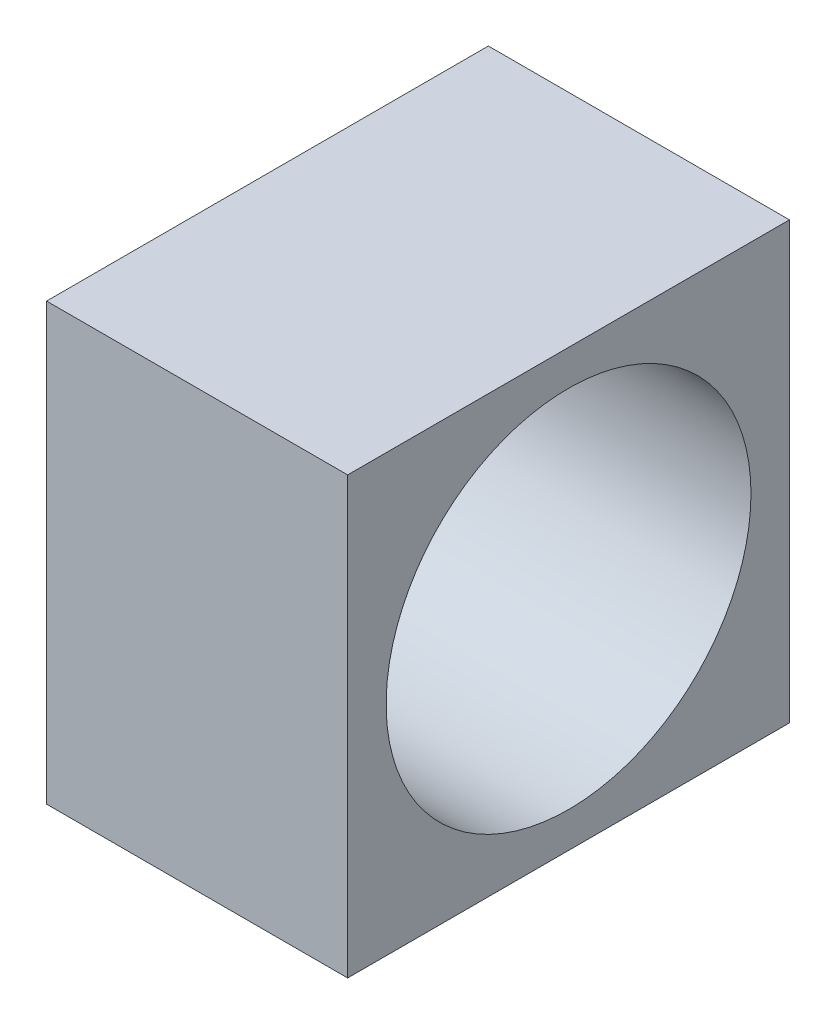
ISO-10303-21;
HEADER;
FILE_DESCRIPTION(('STEP AP214'),'2;1');
FILE_NAME('part.step','',(''),(''),'','','');
FILE_SCHEMA(('AUTOMOTIVE_DESIGN { 1 0 10303 214 1 1 1 1 }'));
ENDSEC;
DATA;
#1=APPLICATION_CONTEXT('core data for automotive mechanical design processes');
#2=APPLICATION_PROTOCOL_DEFINITION('international standard','automotive_design',2000,#1);
#3=PRODUCT_CONTEXT('',#1,'mechanical');
#4=PRODUCT('Part','Part','',(#3));
#5=PRODUCT_RELATED_PRODUCT_CATEGORY('part','',(#4));
#6=PRODUCT_DEFINITION_FORMATION('','',#4);
#7=PRODUCT_DEFINITION_CONTEXT('part definition',#1,'design');
#8=PRODUCT_DEFINITION('design','',#6,#7);
#9=PRODUCT_DEFINITION_SHAPE('','',#8);
#10=(LENGTH_UNIT() NAMED_UNIT(*) SI_UNIT(.MILLI.,.METRE.));
#11=(NAMED_UNIT(*) PLANE_ANGLE_UNIT() SI_UNIT($,.RADIAN.));
#12=(NAMED_UNIT(*) SI_UNIT($,.STERADIAN.) SOLID_ANGLE_UNIT());
#13=UNCERTAINTY_MEASURE_WITH_UNIT(LENGTH_MEASURE(1.E-05),#10,'distance_accuracy_value','');
#14=(GEOMETRIC_REPRESENTATION_CONTEXT(3) GLOBAL_UNCERTAINTY_ASSIGNED_CONTEXT((#13)) GLOBAL_UNIT_ASSIGNED_CONTEXT((#10,
#11,#12)) REPRESENTATION_CONTEXT('',''));
#15=CARTESIAN_POINT('',(0.,0.,0.));
#16=DIRECTION('',(0.,0.,1.));
#17=DIRECTION('',(1.,0.,0.));
#18=AXIS2_PLACEMENT_3D('',#15,#16,#17);
#19=CARTESIAN_POINT('',(8.5,0.,0.));
#20=DIRECTION('',(1.,0.,0.));
#21=DIRECTION('',(0.,0.,-1.));
#22=AXIS2_PLACEMENT_3D('',#19,#20,#21);
#23=PLANE('',#22);
#24=DIRECTION('',(0.,1.,0.));
#25=VECTOR('',#24,1.);
#26=CARTESIAN_POINT('',(8.5,6.15,-6.23588768431528));
#27=LINE('',#26,#25);
#28=CARTESIAN_POINT('',(8.5,-6.15,-6.23588768431528));
#29=VERTEX_POINT('',#28);
#30=CARTESIAN_POINT('',(8.5,6.15,-6.23588768431528));
#31=VERTEX_POINT('',#30);
#32=EDGE_CURVE('E92',#29,#31,#27,.T.);
#33=ORIENTED_EDGE('',*,*,#32,.T.);
#34=DIRECTION('',(0.,0.,1.));
#35=VECTOR('',#34,1.);
#36=CARTESIAN_POINT('',(8.5,6.15,6.23588768431528));
#37=LINE('',#36,#35);
#38=CARTESIAN_POINT('',(8.5,6.15,6.23588768431528));
#39=VERTEX_POINT('',#38);
#40=EDGE_CURVE('E87',#31,#39,#37,.T.);
#41=ORIENTED_EDGE('',*,*,#40,.T.);
#42=DIRECTION('',(0.,-1.,0.));
#43=VECTOR('',#42,1.);
#44=CARTESIAN_POINT('',(8.5,6.15,6.23588768431528));
#45=LINE('',#44,#43);
#46=CARTESIAN_POINT('',(8.5,-6.15,6.23588768431528));
#47=VERTEX_POINT('',#46);
#48=EDGE_CURVE('E90',#39,#47,#45,.T.);
#49=ORIENTED_EDGE('',*,*,#48,.T.);
#50=DIRECTION('',(0.,0.,-1.));
#51=VECTOR('',#50,1.);
#52=CARTESIAN_POINT('',(8.5,-6.15,6.23588768431528));
#53=LINE('',#52,#51);
#54=EDGE_CURVE('E57',#47,#29,#53,.T.);
#55=ORIENTED_EDGE('',*,*,#54,.T.);
#56=EDGE_LOOP('',(#33,#41,#49,#55));
#57=FACE_BOUND('',#56,.T.);
#58=CARTESIAN_POINT('',(8.5,0.,0.));
#59=DIRECTION('',(1.,0.,0.));
#60=DIRECTION('',(0.,0.,-1.));
#61=AXIS2_PLACEMENT_3D('',#58,#59,#60);
#62=CIRCLE('',#61,5.15);
#63=CARTESIAN_POINT('',(8.5,0.,-5.15));
#64=VERTEX_POINT('',#63);
#65=EDGE_CURVE('E112',#64,#64,#62,.T.);
#66=ORIENTED_EDGE('',*,*,#65,.F.);
#67=EDGE_LOOP('',(#66));
#68=FACE_BOUND('',#67,.T.);
#69=ADVANCED_FACE('F39',(#57,#68),#23,.T.);
#70=CARTESIAN_POINT('',(0.,0.,0.));
#71=DIRECTION('',(1.,0.,0.));
#72=DIRECTION('',(0.,0.,-1.));
#73=AXIS2_PLACEMENT_3D('',#70,#71,#72);
#74=PLANE('',#73);
#75=DIRECTION('',(0.,1.,0.));
#76=VECTOR('',#75,1.);
#77=CARTESIAN_POINT('',(0.,6.15,-6.23588768431528));
#78=LINE('',#77,#76);
#79=CARTESIAN_POINT('',(0.,-6.15,-6.23588768431528));
#80=VERTEX_POINT('',#79);
#81=CARTESIAN_POINT('',(0.,6.15,-6.23588768431528));
#82=VERTEX_POINT('',#81);
#83=EDGE_CURVE('E108',#80,#82,#78,.T.);
#84=ORIENTED_EDGE('',*,*,#83,.F.);
#85=DIRECTION('',(0.,0.,-1.));
#86=VECTOR('',#85,1.);
#87=CARTESIAN_POINT('',(0.,-6.15,6.23588768431528));
#88=LINE('',#87,#86);
#89=CARTESIAN_POINT('',(0.,-6.15,6.23588768431528));
#90=VERTEX_POINT('',#89);
#91=EDGE_CURVE('E80',#90,#80,#88,.T.);
#92=ORIENTED_EDGE('',*,*,#91,.F.);
#93=DIRECTION('',(0.,-1.,0.));
#94=VECTOR('',#93,1.);
#95=CARTESIAN_POINT('',(0.,6.15,6.23588768431528));
#96=LINE('',#95,#94);
#97=CARTESIAN_POINT('',(0.,6.15,6.23588768431528));
#98=VERTEX_POINT('',#97);
#99=EDGE_CURVE('E74',#98,#90,#96,.T.);
#100=ORIENTED_EDGE('',*,*,#99,.F.);
#101=DIRECTION('',(0.,0.,1.));
#102=VECTOR('',#101,1.);
#103=CARTESIAN_POINT('',(0.,6.15,6.23588768431528));
#104=LINE('',#103,#102);
#105=EDGE_CURVE('E97',#82,#98,#104,.T.);
#106=ORIENTED_EDGE('',*,*,#105,.F.);
#107=EDGE_LOOP('',(#84,#92,#100,#106));
#108=FACE_BOUND('',#107,.T.);
#109=CARTESIAN_POINT('',(0.,0.,0.));
#110=DIRECTION('',(1.,0.,0.));
#111=DIRECTION('',(0.,0.,-1.));
#112=AXIS2_PLACEMENT_3D('',#109,#110,#111);
#113=CIRCLE('',#112,5.15);
#114=CARTESIAN_POINT('',(0.,0.,-5.15));
#115=VERTEX_POINT('',#114);
#116=EDGE_CURVE('E130',#115,#115,#113,.T.);
#117=ORIENTED_EDGE('',*,*,#116,.T.);
#118=EDGE_LOOP('',(#117));
#119=FACE_BOUND('',#118,.T.);
#120=ADVANCED_FACE('F125',(#108,#119),#74,.F.);
#121=CARTESIAN_POINT('',(8.5,6.15,-6.23588768431528));
#122=DIRECTION('',(0.,0.,1.));
#123=DIRECTION('',(0.,-1.,0.));
#124=AXIS2_PLACEMENT_3D('',#121,#122,#123);
#125=PLANE('',#124);
#126=ORIENTED_EDGE('',*,*,#83,.T.);
#127=DIRECTION('',(-1.,0.,0.));
#128=VECTOR('',#127,1.);
#129=CARTESIAN_POINT('',(8.5,6.15,-6.23588768431528));
#130=LINE('',#129,#128);
#131=EDGE_CURVE('E11',#31,#82,#130,.T.);
#132=ORIENTED_EDGE('',*,*,#131,.F.);
#133=ORIENTED_EDGE('',*,*,#32,.F.);
#134=DIRECTION('',(-1.,0.,0.));
#135=VECTOR('',#134,1.);
#136=CARTESIAN_POINT('',(8.5,-6.15,-6.23588768431528));
#137=LINE('',#136,#135);
#138=EDGE_CURVE('E104',#29,#80,#137,.T.);
#139=ORIENTED_EDGE('',*,*,#138,.T.);
#140=EDGE_LOOP('',(#126,#132,#133,#139));
#141=FACE_BOUND('',#140,.T.);
#142=ADVANCED_FACE('F41',(#141),#125,.F.);
#143=CARTESIAN_POINT('',(8.5,6.15,6.23588768431528));
#144=DIRECTION('',(0.,-1.,0.));
#145=DIRECTION('',(0.,0.,-1.));
#146=AXIS2_PLACEMENT_3D('',#143,#144,#145);
#147=PLANE('',#146);
#148=ORIENTED_EDGE('',*,*,#105,.T.);
#149=DIRECTION('',(-1.,0.,0.));
#150=VECTOR('',#149,1.);
#151=CARTESIAN_POINT('',(8.5,6.15,6.23588768431528));
#152=LINE('',#151,#150);
#153=EDGE_CURVE('E49',#39,#98,#152,.T.);
#154=ORIENTED_EDGE('',*,*,#153,.F.);
#155=ORIENTED_EDGE('',*,*,#40,.F.);
#156=ORIENTED_EDGE('',*,*,#131,.T.);
#157=EDGE_LOOP('',(#148,#154,#155,#156));
#158=FACE_BOUND('',#157,.T.);
#159=ADVANCED_FACE('F96',(#158),#147,.F.);
#160=CARTESIAN_POINT('',(8.5,6.15,6.23588768431528));
#161=DIRECTION('',(0.,0.,-1.));
#162=DIRECTION('',(-1.,0.,0.));
#163=AXIS2_PLACEMENT_3D('',#160,#161,#162);
#164=PLANE('',#163);
#165=ORIENTED_EDGE('',*,*,#99,.T.);
#166=DIRECTION('',(-1.,0.,0.));
#167=VECTOR('',#166,1.);
#168=CARTESIAN_POINT('',(8.5,-6.15,6.23588768431528));
#169=LINE('',#168,#167);
#170=EDGE_CURVE('E99',#47,#90,#169,.T.);
#171=ORIENTED_EDGE('',*,*,#170,.F.);
#172=ORIENTED_EDGE('',*,*,#48,.F.);
#173=ORIENTED_EDGE('',*,*,#153,.T.);
#174=EDGE_LOOP('',(#165,#171,#172,#173));
#175=FACE_BOUND('',#174,.T.);
#176=ADVANCED_FACE('F100',(#175),#164,.F.);
#177=CARTESIAN_POINT('',(8.5,-6.15,6.23588768431528));
#178=DIRECTION('',(0.,1.,0.));
#179=DIRECTION('',(0.,0.,1.));
#180=AXIS2_PLACEMENT_3D('',#177,#178,#179);
#181=PLANE('',#180);
#182=ORIENTED_EDGE('',*,*,#91,.T.);
#183=ORIENTED_EDGE('',*,*,#138,.F.);
#184=ORIENTED_EDGE('',*,*,#54,.F.);
#185=ORIENTED_EDGE('',*,*,#170,.T.);
#186=EDGE_LOOP('',(#182,#183,#184,#185));
#187=FACE_BOUND('',#186,.T.);
#188=ADVANCED_FACE('F122',(#187),#181,.F.);
#189=CARTESIAN_POINT('',(8.5,0.,0.));
#190=DIRECTION('',(-1.,0.,0.));
#191=DIRECTION('',(0.,0.,1.));
#192=AXIS2_PLACEMENT_3D('',#189,#190,#191);
#193=CYLINDRICAL_SURFACE('',#192,5.15);
#194=ORIENTED_EDGE('',*,*,#65,.T.);
#195=EDGE_LOOP('',(#194));
#196=FACE_BOUND('',#195,.T.);
#197=ORIENTED_EDGE('',*,*,#116,.F.);
#198=EDGE_LOOP('',(#197));
#199=FACE_BOUND('',#198,.T.);
#200=ADVANCED_FACE('F138',(#196,#199),#193,.F.);
#201=CLOSED_SHELL('',(#69,#120,#142,#159,#176,#188,#200));
#202=MANIFOLD_SOLID_BREP('B2',#201);
#203=ADVANCED_BREP_SHAPE_REPRESENTATION('',(#18,#202),#14);
#204=SHAPE_DEFINITION_REPRESENTATION(#9,#203);
ENDSEC;
END-ISO-10303-21;
